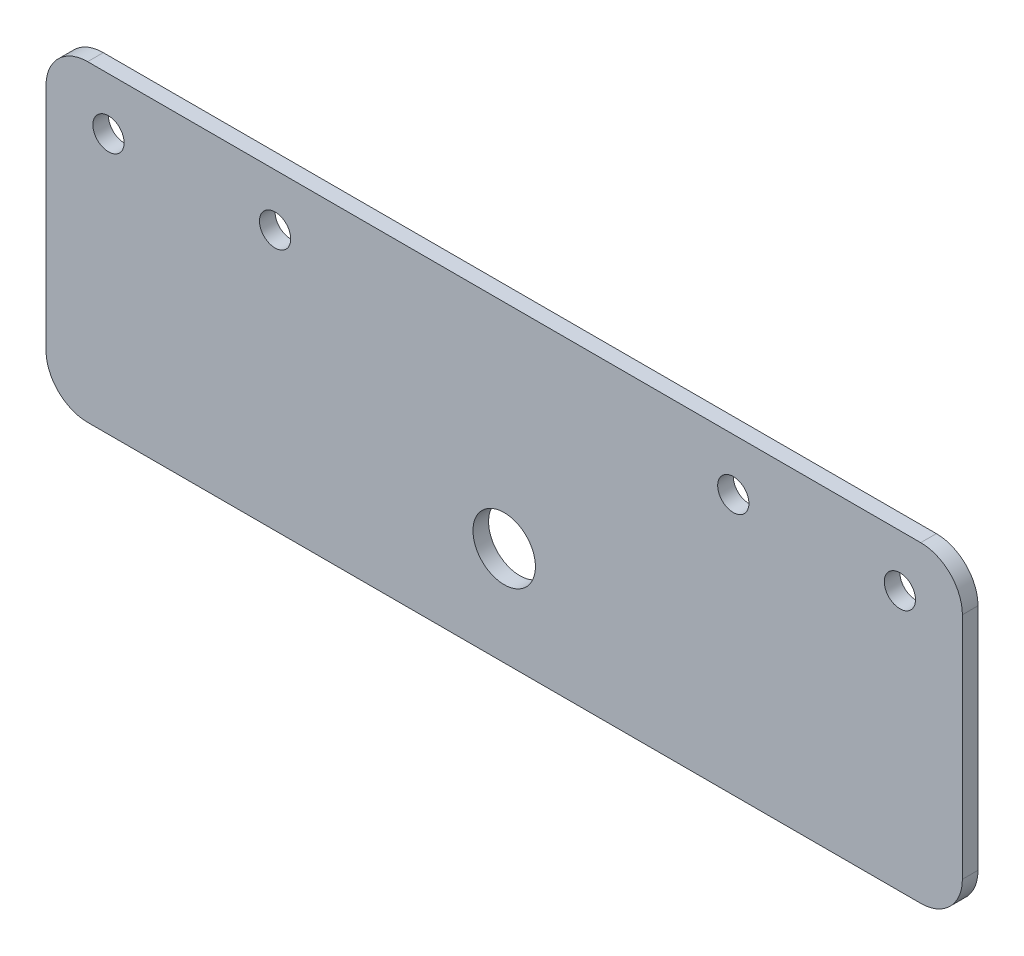
ISO-10303-21;
HEADER;
FILE_DESCRIPTION(('STEP AP214'),'2;1');
FILE_NAME('part.step','',(''),(''),'','','');
FILE_SCHEMA(('AUTOMOTIVE_DESIGN { 1 0 10303 214 1 1 1 1 }'));
ENDSEC;
DATA;
#1=APPLICATION_CONTEXT('core data for automotive mechanical design processes');
#2=APPLICATION_PROTOCOL_DEFINITION('international standard','automotive_design',2000,#1);
#3=PRODUCT_CONTEXT('',#1,'mechanical');
#4=PRODUCT('Part','Part','',(#3));
#5=PRODUCT_RELATED_PRODUCT_CATEGORY('part','',(#4));
#6=PRODUCT_DEFINITION_FORMATION('','',#4);
#7=PRODUCT_DEFINITION_CONTEXT('part definition',#1,'design');
#8=PRODUCT_DEFINITION('design','',#6,#7);
#9=PRODUCT_DEFINITION_SHAPE('','',#8);
#10=(LENGTH_UNIT() NAMED_UNIT(*) SI_UNIT(.MILLI.,.METRE.));
#11=(NAMED_UNIT(*) PLANE_ANGLE_UNIT() SI_UNIT($,.RADIAN.));
#12=(NAMED_UNIT(*) SI_UNIT($,.STERADIAN.) SOLID_ANGLE_UNIT());
#13=UNCERTAINTY_MEASURE_WITH_UNIT(LENGTH_MEASURE(1.E-05),#10,'distance_accuracy_value','');
#14=(GEOMETRIC_REPRESENTATION_CONTEXT(3) GLOBAL_UNCERTAINTY_ASSIGNED_CONTEXT((#13)) GLOBAL_UNIT_ASSIGNED_CONTEXT((#10,
#11,#12)) REPRESENTATION_CONTEXT('',''));
#15=CARTESIAN_POINT('',(0.,0.,0.));
#16=DIRECTION('',(0.,0.,1.));
#17=DIRECTION('',(1.,0.,0.));
#18=AXIS2_PLACEMENT_3D('',#15,#16,#17);
#19=CARTESIAN_POINT('',(-35.8012608557159,7.03084673362314,1.5));
#20=DIRECTION('',(0.,0.,-1.));
#21=DIRECTION('',(-1.,0.,0.));
#22=AXIS2_PLACEMENT_3D('',#19,#20,#21);
#23=PLANE('',#22);
#24=DIRECTION('',(-1.,0.,0.));
#25=VECTOR('',#24,1.);
#26=CARTESIAN_POINT('',(-25.8012608557159,11.0308467336231,1.5));
#27=LINE('',#26,#25);
#28=CARTESIAN_POINT('',(44.1987391442841,11.0308467336231,1.5));
#29=VERTEX_POINT('',#28);
#30=CARTESIAN_POINT('',(-35.8012608557159,11.0308467336231,1.5));
#31=VERTEX_POINT('',#30);
#32=EDGE_CURVE('E57',#29,#31,#27,.T.);
#33=ORIENTED_EDGE('',*,*,#32,.T.);
#34=CARTESIAN_POINT('',(-35.8012608557159,7.03084673362314,1.5));
#35=DIRECTION('',(0.,0.,1.));
#36=DIRECTION('',(-1.,0.,0.));
#37=AXIS2_PLACEMENT_3D('',#34,#35,#36);
#38=CIRCLE('',#37,4.);
#39=CARTESIAN_POINT('',(-39.8012608557159,7.03084673362311,1.5));
#40=VERTEX_POINT('',#39);
#41=EDGE_CURVE('E102',#31,#40,#38,.T.);
#42=ORIENTED_EDGE('',*,*,#41,.T.);
#43=DIRECTION('',(0.,-1.,0.));
#44=VECTOR('',#43,1.);
#45=CARTESIAN_POINT('',(-39.8012608557159,7.03084673362311,1.5));
#46=LINE('',#45,#44);
#47=CARTESIAN_POINT('',(-39.8012608557159,-14.9691532663769,1.5));
#48=VERTEX_POINT('',#47);
#49=EDGE_CURVE('E189',#40,#48,#46,.T.);
#50=ORIENTED_EDGE('',*,*,#49,.T.);
#51=CARTESIAN_POINT('',(-35.8012608557159,-14.9691532663769,1.5));
#52=DIRECTION('',(0.,0.,1.));
#53=DIRECTION('',(-1.,0.,0.));
#54=AXIS2_PLACEMENT_3D('',#51,#52,#53);
#55=CIRCLE('',#54,4.);
#56=CARTESIAN_POINT('',(-35.8012608557159,-18.9691532663769,1.5));
#57=VERTEX_POINT('',#56);
#58=EDGE_CURVE('E200',#48,#57,#55,.T.);
#59=ORIENTED_EDGE('',*,*,#58,.T.);
#60=DIRECTION('',(1.,0.,0.));
#61=VECTOR('',#60,1.);
#62=CARTESIAN_POINT('',(-35.8012608557159,-18.9691532663769,1.5));
#63=LINE('',#62,#61);
#64=CARTESIAN_POINT('',(44.1987391442841,-18.9691532663769,1.5));
#65=VERTEX_POINT('',#64);
#66=EDGE_CURVE('E122',#57,#65,#63,.T.);
#67=ORIENTED_EDGE('',*,*,#66,.T.);
#68=CARTESIAN_POINT('',(44.1987391442841,-14.9691532663769,1.5));
#69=DIRECTION('',(0.,0.,1.));
#70=DIRECTION('',(-1.,0.,0.));
#71=AXIS2_PLACEMENT_3D('',#68,#69,#70);
#72=CIRCLE('',#71,4.);
#73=CARTESIAN_POINT('',(48.1987391442841,-14.9691532663768,1.5));
#74=VERTEX_POINT('',#73);
#75=EDGE_CURVE('E116',#65,#74,#72,.T.);
#76=ORIENTED_EDGE('',*,*,#75,.T.);
#77=DIRECTION('',(0.,1.,0.));
#78=VECTOR('',#77,1.);
#79=CARTESIAN_POINT('',(48.1987391442841,7.03084673362311,1.5));
#80=LINE('',#79,#78);
#81=CARTESIAN_POINT('',(48.1987391442841,7.03084673362311,1.5));
#82=VERTEX_POINT('',#81);
#83=EDGE_CURVE('E120',#74,#82,#80,.T.);
#84=ORIENTED_EDGE('',*,*,#83,.T.);
#85=CARTESIAN_POINT('',(44.1987391442841,7.03084673362314,1.5));
#86=DIRECTION('',(0.,0.,1.));
#87=DIRECTION('',(-1.,0.,0.));
#88=AXIS2_PLACEMENT_3D('',#85,#86,#87);
#89=CIRCLE('',#88,4.);
#90=EDGE_CURVE('E139',#82,#29,#89,.T.);
#91=ORIENTED_EDGE('',*,*,#90,.T.);
#92=EDGE_LOOP('',(#33,#42,#50,#59,#67,#76,#84,#91));
#93=FACE_BOUND('',#92,.T.);
#94=CARTESIAN_POINT('',(4.19873914428409,-9.46915326637686,1.5));
#95=DIRECTION('',(0.,0.,1.));
#96=DIRECTION('',(1.,0.,0.));
#97=AXIS2_PLACEMENT_3D('',#94,#95,#96);
#98=CIRCLE('',#97,3.);
#99=CARTESIAN_POINT('',(7.19873914428409,-9.46915326637686,1.5));
#100=VERTEX_POINT('',#99);
#101=EDGE_CURVE('E150',#100,#100,#98,.T.);
#102=ORIENTED_EDGE('',*,*,#101,.F.);
#103=EDGE_LOOP('',(#102));
#104=FACE_BOUND('',#103,.T.);
#105=CARTESIAN_POINT('',(-17.8012608557159,6.03084673362314,1.5));
#106=DIRECTION('',(0.,0.,1.));
#107=DIRECTION('',(1.,0.,0.));
#108=AXIS2_PLACEMENT_3D('',#105,#106,#107);
#109=CIRCLE('',#108,1.5);
#110=CARTESIAN_POINT('',(-16.3012608557159,6.03084673362314,1.5));
#111=VERTEX_POINT('',#110);
#112=EDGE_CURVE('E214',#111,#111,#109,.T.);
#113=ORIENTED_EDGE('',*,*,#112,.F.);
#114=EDGE_LOOP('',(#113));
#115=FACE_BOUND('',#114,.T.);
#116=CARTESIAN_POINT('',(-33.8012608557159,6.03084673362314,1.5));
#117=DIRECTION('',(0.,0.,1.));
#118=DIRECTION('',(1.,0.,0.));
#119=AXIS2_PLACEMENT_3D('',#116,#117,#118);
#120=CIRCLE('',#119,1.5);
#121=CARTESIAN_POINT('',(-32.3012608557159,6.03084673362314,1.5));
#122=VERTEX_POINT('',#121);
#123=EDGE_CURVE('E222',#122,#122,#120,.T.);
#124=ORIENTED_EDGE('',*,*,#123,.F.);
#125=EDGE_LOOP('',(#124));
#126=FACE_BOUND('',#125,.T.);
#127=CARTESIAN_POINT('',(26.1987391442841,6.03084673362314,1.5));
#128=DIRECTION('',(0.,0.,1.));
#129=DIRECTION('',(1.,0.,0.));
#130=AXIS2_PLACEMENT_3D('',#127,#128,#129);
#131=CIRCLE('',#130,1.5);
#132=CARTESIAN_POINT('',(27.6987391442841,6.03084673362314,1.5));
#133=VERTEX_POINT('',#132);
#134=EDGE_CURVE('E230',#133,#133,#131,.T.);
#135=ORIENTED_EDGE('',*,*,#134,.F.);
#136=EDGE_LOOP('',(#135));
#137=FACE_BOUND('',#136,.T.);
#138=CARTESIAN_POINT('',(42.1987391442841,6.03084673362314,1.5));
#139=DIRECTION('',(0.,0.,1.));
#140=DIRECTION('',(1.,0.,0.));
#141=AXIS2_PLACEMENT_3D('',#138,#139,#140);
#142=CIRCLE('',#141,1.5);
#143=CARTESIAN_POINT('',(43.6987391442841,6.03084673362314,1.5));
#144=VERTEX_POINT('',#143);
#145=EDGE_CURVE('E238',#144,#144,#142,.T.);
#146=ORIENTED_EDGE('',*,*,#145,.F.);
#147=EDGE_LOOP('',(#146));
#148=FACE_BOUND('',#147,.T.);
#149=ADVANCED_FACE('F39',(#93,#104,#115,#126,#137,#148),#23,.F.);
#150=CARTESIAN_POINT('',(-35.8012608557159,7.03084673362314,0.));
#151=DIRECTION('',(0.,0.,-1.));
#152=DIRECTION('',(-1.,0.,0.));
#153=AXIS2_PLACEMENT_3D('',#150,#151,#152);
#154=PLANE('',#153);
#155=CARTESIAN_POINT('',(26.1987391442841,6.03084673362314,0.));
#156=DIRECTION('',(0.,0.,1.));
#157=DIRECTION('',(1.,0.,0.));
#158=AXIS2_PLACEMENT_3D('',#155,#156,#157);
#159=CIRCLE('',#158,1.5);
#160=CARTESIAN_POINT('',(27.6987391442841,6.03084673362314,0.));
#161=VERTEX_POINT('',#160);
#162=EDGE_CURVE('E234',#161,#161,#159,.T.);
#163=ORIENTED_EDGE('',*,*,#162,.T.);
#164=EDGE_LOOP('',(#163));
#165=FACE_BOUND('',#164,.T.);
#166=CARTESIAN_POINT('',(-17.8012608557159,6.03084673362314,0.));
#167=DIRECTION('',(0.,0.,1.));
#168=DIRECTION('',(1.,0.,0.));
#169=AXIS2_PLACEMENT_3D('',#166,#167,#168);
#170=CIRCLE('',#169,1.5);
#171=CARTESIAN_POINT('',(-16.3012608557159,6.03084673362314,0.));
#172=VERTEX_POINT('',#171);
#173=EDGE_CURVE('E218',#172,#172,#170,.T.);
#174=ORIENTED_EDGE('',*,*,#173,.T.);
#175=EDGE_LOOP('',(#174));
#176=FACE_BOUND('',#175,.T.);
#177=CARTESIAN_POINT('',(-35.8012608557159,7.03084673362314,0.));
#178=DIRECTION('',(0.,0.,1.));
#179=DIRECTION('',(-1.,0.,0.));
#180=AXIS2_PLACEMENT_3D('',#177,#178,#179);
#181=CIRCLE('',#180,4.);
#182=CARTESIAN_POINT('',(-35.8012608557159,11.0308467336231,0.));
#183=VERTEX_POINT('',#182);
#184=CARTESIAN_POINT('',(-39.8012608557159,7.03084673362311,0.));
#185=VERTEX_POINT('',#184);
#186=EDGE_CURVE('E146',#183,#185,#181,.T.);
#187=ORIENTED_EDGE('',*,*,#186,.F.);
#188=DIRECTION('',(-1.,0.,0.));
#189=VECTOR('',#188,1.);
#190=CARTESIAN_POINT('',(-25.8012608557159,11.0308467336231,0.));
#191=LINE('',#190,#189);
#192=CARTESIAN_POINT('',(44.1987391442841,11.0308467336231,0.));
#193=VERTEX_POINT('',#192);
#194=EDGE_CURVE('E94',#193,#183,#191,.T.);
#195=ORIENTED_EDGE('',*,*,#194,.F.);
#196=CARTESIAN_POINT('',(44.1987391442841,7.03084673362314,0.));
#197=DIRECTION('',(0.,0.,1.));
#198=DIRECTION('',(-1.,0.,0.));
#199=AXIS2_PLACEMENT_3D('',#196,#197,#198);
#200=CIRCLE('',#199,4.);
#201=CARTESIAN_POINT('',(48.1987391442841,7.03084673362311,0.));
#202=VERTEX_POINT('',#201);
#203=EDGE_CURVE('E164',#202,#193,#200,.T.);
#204=ORIENTED_EDGE('',*,*,#203,.F.);
#205=DIRECTION('',(0.,1.,0.));
#206=VECTOR('',#205,1.);
#207=CARTESIAN_POINT('',(48.1987391442841,7.03084673362311,0.));
#208=LINE('',#207,#206);
#209=CARTESIAN_POINT('',(48.1987391442841,-14.9691532663768,0.));
#210=VERTEX_POINT('',#209);
#211=EDGE_CURVE('E87',#210,#202,#208,.T.);
#212=ORIENTED_EDGE('',*,*,#211,.F.);
#213=CARTESIAN_POINT('',(44.1987391442841,-14.9691532663769,0.));
#214=DIRECTION('',(0.,0.,1.));
#215=DIRECTION('',(-1.,0.,0.));
#216=AXIS2_PLACEMENT_3D('',#213,#214,#215);
#217=CIRCLE('',#216,4.);
#218=CARTESIAN_POINT('',(44.1987391442841,-18.9691532663769,0.));
#219=VERTEX_POINT('',#218);
#220=EDGE_CURVE('E131',#219,#210,#217,.T.);
#221=ORIENTED_EDGE('',*,*,#220,.F.);
#222=DIRECTION('',(1.,0.,0.));
#223=VECTOR('',#222,1.);
#224=CARTESIAN_POINT('',(44.1987391442841,-18.9691532663769,0.));
#225=LINE('',#224,#223);
#226=CARTESIAN_POINT('',(-35.8012608557159,-18.9691532663769,0.));
#227=VERTEX_POINT('',#226);
#228=EDGE_CURVE('E157',#227,#219,#225,.T.);
#229=ORIENTED_EDGE('',*,*,#228,.F.);
#230=CARTESIAN_POINT('',(-35.8012608557159,-14.9691532663769,0.));
#231=DIRECTION('',(0.,0.,1.));
#232=DIRECTION('',(-1.,0.,0.));
#233=AXIS2_PLACEMENT_3D('',#230,#231,#232);
#234=CIRCLE('',#233,4.);
#235=CARTESIAN_POINT('',(-39.8012608557159,-14.9691532663769,0.));
#236=VERTEX_POINT('',#235);
#237=EDGE_CURVE('E153',#236,#227,#234,.T.);
#238=ORIENTED_EDGE('',*,*,#237,.F.);
#239=DIRECTION('',(0.,-1.,0.));
#240=VECTOR('',#239,1.);
#241=CARTESIAN_POINT('',(-39.8012608557159,7.03084673362311,0.));
#242=LINE('',#241,#240);
#243=EDGE_CURVE('E149',#185,#236,#242,.T.);
#244=ORIENTED_EDGE('',*,*,#243,.F.);
#245=EDGE_LOOP('',(#187,#195,#204,#212,#221,#229,#238,#244));
#246=FACE_BOUND('',#245,.T.);
#247=CARTESIAN_POINT('',(4.19873914428409,-9.46915326637686,0.));
#248=DIRECTION('',(0.,0.,1.));
#249=DIRECTION('',(1.,0.,0.));
#250=AXIS2_PLACEMENT_3D('',#247,#248,#249);
#251=CIRCLE('',#250,3.);
#252=CARTESIAN_POINT('',(7.19873914428409,-9.46915326637686,0.));
#253=VERTEX_POINT('',#252);
#254=EDGE_CURVE('E210',#253,#253,#251,.T.);
#255=ORIENTED_EDGE('',*,*,#254,.T.);
#256=EDGE_LOOP('',(#255));
#257=FACE_BOUND('',#256,.T.);
#258=CARTESIAN_POINT('',(-33.8012608557159,6.03084673362314,0.));
#259=DIRECTION('',(0.,0.,1.));
#260=DIRECTION('',(1.,0.,0.));
#261=AXIS2_PLACEMENT_3D('',#258,#259,#260);
#262=CIRCLE('',#261,1.5);
#263=CARTESIAN_POINT('',(-32.3012608557159,6.03084673362314,0.));
#264=VERTEX_POINT('',#263);
#265=EDGE_CURVE('E226',#264,#264,#262,.T.);
#266=ORIENTED_EDGE('',*,*,#265,.T.);
#267=EDGE_LOOP('',(#266));
#268=FACE_BOUND('',#267,.T.);
#269=CARTESIAN_POINT('',(42.1987391442841,6.03084673362314,0.));
#270=DIRECTION('',(0.,0.,1.));
#271=DIRECTION('',(1.,0.,0.));
#272=AXIS2_PLACEMENT_3D('',#269,#270,#271);
#273=CIRCLE('',#272,1.5);
#274=CARTESIAN_POINT('',(43.6987391442841,6.03084673362314,0.));
#275=VERTEX_POINT('',#274);
#276=EDGE_CURVE('E242',#275,#275,#273,.T.);
#277=ORIENTED_EDGE('',*,*,#276,.T.);
#278=EDGE_LOOP('',(#277));
#279=FACE_BOUND('',#278,.T.);
#280=ADVANCED_FACE('F191',(#165,#176,#246,#257,#268,#279),#154,.T.);
#281=CARTESIAN_POINT('',(-35.8012608557159,7.03084673362314,1.5));
#282=DIRECTION('',(0.,0.,-1.));
#283=DIRECTION('',(-1.,0.,0.));
#284=AXIS2_PLACEMENT_3D('',#281,#282,#283);
#285=CYLINDRICAL_SURFACE('',#284,4.);
#286=ORIENTED_EDGE('',*,*,#186,.T.);
#287=DIRECTION('',(0.,0.,-1.));
#288=VECTOR('',#287,1.);
#289=CARTESIAN_POINT('',(-39.8012608557159,7.03084673362311,1.5));
#290=LINE('',#289,#288);
#291=EDGE_CURVE('E49',#40,#185,#290,.T.);
#292=ORIENTED_EDGE('',*,*,#291,.F.);
#293=ORIENTED_EDGE('',*,*,#41,.F.);
#294=DIRECTION('',(0.,0.,-1.));
#295=VECTOR('',#294,1.);
#296=CARTESIAN_POINT('',(-35.8012608557159,11.0308467336231,1.5));
#297=LINE('',#296,#295);
#298=EDGE_CURVE('E11',#31,#183,#297,.T.);
#299=ORIENTED_EDGE('',*,*,#298,.T.);
#300=EDGE_LOOP('',(#286,#292,#293,#299));
#301=FACE_BOUND('',#300,.T.);
#302=ADVANCED_FACE('F41',(#301),#285,.T.);
#303=CARTESIAN_POINT('',(-39.8012608557159,7.03084673362311,1.5));
#304=DIRECTION('',(1.,0.,0.));
#305=DIRECTION('',(0.,0.,-1.));
#306=AXIS2_PLACEMENT_3D('',#303,#304,#305);
#307=PLANE('',#306);
#308=ORIENTED_EDGE('',*,*,#243,.T.);
#309=DIRECTION('',(0.,0.,-1.));
#310=VECTOR('',#309,1.);
#311=CARTESIAN_POINT('',(-39.8012608557159,-14.9691532663769,1.5));
#312=LINE('',#311,#310);
#313=EDGE_CURVE('E179',#48,#236,#312,.T.);
#314=ORIENTED_EDGE('',*,*,#313,.F.);
#315=ORIENTED_EDGE('',*,*,#49,.F.);
#316=ORIENTED_EDGE('',*,*,#291,.T.);
#317=EDGE_LOOP('',(#308,#314,#315,#316));
#318=FACE_BOUND('',#317,.T.);
#319=ADVANCED_FACE('F187',(#318),#307,.F.);
#320=CARTESIAN_POINT('',(-35.8012608557159,-14.9691532663769,1.5));
#321=DIRECTION('',(0.,0.,-1.));
#322=DIRECTION('',(-1.,0.,0.));
#323=AXIS2_PLACEMENT_3D('',#320,#321,#322);
#324=CYLINDRICAL_SURFACE('',#323,4.);
#325=ORIENTED_EDGE('',*,*,#237,.T.);
#326=DIRECTION('',(0.,0.,-1.));
#327=VECTOR('',#326,1.);
#328=CARTESIAN_POINT('',(-35.8012608557159,-18.9691532663769,1.5));
#329=LINE('',#328,#327);
#330=EDGE_CURVE('E175',#57,#227,#329,.T.);
#331=ORIENTED_EDGE('',*,*,#330,.F.);
#332=ORIENTED_EDGE('',*,*,#58,.F.);
#333=ORIENTED_EDGE('',*,*,#313,.T.);
#334=EDGE_LOOP('',(#325,#331,#332,#333));
#335=FACE_BOUND('',#334,.T.);
#336=ADVANCED_FACE('F195',(#335),#324,.T.);
#337=CARTESIAN_POINT('',(44.1987391442841,-18.9691532663769,1.5));
#338=DIRECTION('',(0.,1.,0.));
#339=DIRECTION('',(0.,0.,1.));
#340=AXIS2_PLACEMENT_3D('',#337,#338,#339);
#341=PLANE('',#340);
#342=ORIENTED_EDGE('',*,*,#228,.T.);
#343=DIRECTION('',(0.,0.,-1.));
#344=VECTOR('',#343,1.);
#345=CARTESIAN_POINT('',(44.1987391442841,-18.9691532663769,1.5));
#346=LINE('',#345,#344);
#347=EDGE_CURVE('E133',#65,#219,#346,.T.);
#348=ORIENTED_EDGE('',*,*,#347,.F.);
#349=ORIENTED_EDGE('',*,*,#66,.F.);
#350=ORIENTED_EDGE('',*,*,#330,.T.);
#351=EDGE_LOOP('',(#342,#348,#349,#350));
#352=FACE_BOUND('',#351,.T.);
#353=ADVANCED_FACE('F198',(#352),#341,.F.);
#354=CARTESIAN_POINT('',(44.1987391442841,-14.9691532663769,1.5));
#355=DIRECTION('',(0.,0.,-1.));
#356=DIRECTION('',(-1.,0.,0.));
#357=AXIS2_PLACEMENT_3D('',#354,#355,#356);
#358=CYLINDRICAL_SURFACE('',#357,4.);
#359=ORIENTED_EDGE('',*,*,#220,.T.);
#360=DIRECTION('',(0.,0.,-1.));
#361=VECTOR('',#360,1.);
#362=CARTESIAN_POINT('',(48.1987391442841,-14.9691532663768,1.5));
#363=LINE('',#362,#361);
#364=EDGE_CURVE('E128',#74,#210,#363,.T.);
#365=ORIENTED_EDGE('',*,*,#364,.F.);
#366=ORIENTED_EDGE('',*,*,#75,.F.);
#367=ORIENTED_EDGE('',*,*,#347,.T.);
#368=EDGE_LOOP('',(#359,#365,#366,#367));
#369=FACE_BOUND('',#368,.T.);
#370=ADVANCED_FACE('F129',(#369),#358,.T.);
#371=CARTESIAN_POINT('',(48.1987391442841,7.03084673362311,1.5));
#372=DIRECTION('',(-1.,0.,0.));
#373=DIRECTION('',(0.,0.,1.));
#374=AXIS2_PLACEMENT_3D('',#371,#372,#373);
#375=PLANE('',#374);
#376=ORIENTED_EDGE('',*,*,#211,.T.);
#377=DIRECTION('',(0.,0.,-1.));
#378=VECTOR('',#377,1.);
#379=CARTESIAN_POINT('',(48.1987391442841,7.03084673362311,1.5));
#380=LINE('',#379,#378);
#381=EDGE_CURVE('E134',#82,#202,#380,.T.);
#382=ORIENTED_EDGE('',*,*,#381,.F.);
#383=ORIENTED_EDGE('',*,*,#83,.F.);
#384=ORIENTED_EDGE('',*,*,#364,.T.);
#385=EDGE_LOOP('',(#376,#382,#383,#384));
#386=FACE_BOUND('',#385,.T.);
#387=ADVANCED_FACE('F136',(#386),#375,.F.);
#388=CARTESIAN_POINT('',(44.1987391442841,7.03084673362314,1.5));
#389=DIRECTION('',(0.,0.,-1.));
#390=DIRECTION('',(-1.,0.,0.));
#391=AXIS2_PLACEMENT_3D('',#388,#389,#390);
#392=CYLINDRICAL_SURFACE('',#391,4.);
#393=ORIENTED_EDGE('',*,*,#203,.T.);
#394=DIRECTION('',(0.,0.,-1.));
#395=VECTOR('',#394,1.);
#396=CARTESIAN_POINT('',(44.1987391442841,11.0308467336231,1.5));
#397=LINE('',#396,#395);
#398=EDGE_CURVE('E142',#29,#193,#397,.T.);
#399=ORIENTED_EDGE('',*,*,#398,.F.);
#400=ORIENTED_EDGE('',*,*,#90,.F.);
#401=ORIENTED_EDGE('',*,*,#381,.T.);
#402=EDGE_LOOP('',(#393,#399,#400,#401));
#403=FACE_BOUND('',#402,.T.);
#404=ADVANCED_FACE('F267',(#403),#392,.T.);
#405=CARTESIAN_POINT('',(-25.8012608557159,11.0308467336231,1.5));
#406=DIRECTION('',(0.,-1.,0.));
#407=DIRECTION('',(0.,0.,-1.));
#408=AXIS2_PLACEMENT_3D('',#405,#406,#407);
#409=PLANE('',#408);
#410=ORIENTED_EDGE('',*,*,#194,.T.);
#411=ORIENTED_EDGE('',*,*,#298,.F.);
#412=ORIENTED_EDGE('',*,*,#32,.F.);
#413=ORIENTED_EDGE('',*,*,#398,.T.);
#414=EDGE_LOOP('',(#410,#411,#412,#413));
#415=FACE_BOUND('',#414,.T.);
#416=ADVANCED_FACE('F264',(#415),#409,.F.);
#417=CARTESIAN_POINT('',(4.19873914428409,-9.46915326637686,1.5));
#418=DIRECTION('',(0.,0.,-1.));
#419=DIRECTION('',(-1.,0.,0.));
#420=AXIS2_PLACEMENT_3D('',#417,#418,#419);
#421=CYLINDRICAL_SURFACE('',#420,3.);
#422=ORIENTED_EDGE('',*,*,#101,.T.);
#423=EDGE_LOOP('',(#422));
#424=FACE_BOUND('',#423,.T.);
#425=ORIENTED_EDGE('',*,*,#254,.F.);
#426=EDGE_LOOP('',(#425));
#427=FACE_BOUND('',#426,.T.);
#428=ADVANCED_FACE('F261',(#424,#427),#421,.F.);
#429=CARTESIAN_POINT('',(-17.8012608557159,6.03084673362314,1.5));
#430=DIRECTION('',(0.,0.,-1.));
#431=DIRECTION('',(-1.,0.,0.));
#432=AXIS2_PLACEMENT_3D('',#429,#430,#431);
#433=CYLINDRICAL_SURFACE('',#432,1.5);
#434=ORIENTED_EDGE('',*,*,#112,.T.);
#435=EDGE_LOOP('',(#434));
#436=FACE_BOUND('',#435,.T.);
#437=ORIENTED_EDGE('',*,*,#173,.F.);
#438=EDGE_LOOP('',(#437));
#439=FACE_BOUND('',#438,.T.);
#440=ADVANCED_FACE('F351',(#436,#439),#433,.F.);
#441=CARTESIAN_POINT('',(-33.8012608557159,6.03084673362314,1.5));
#442=DIRECTION('',(0.,0.,-1.));
#443=DIRECTION('',(-1.,0.,0.));
#444=AXIS2_PLACEMENT_3D('',#441,#442,#443);
#445=CYLINDRICAL_SURFACE('',#444,1.5);
#446=ORIENTED_EDGE('',*,*,#123,.T.);
#447=EDGE_LOOP('',(#446));
#448=FACE_BOUND('',#447,.T.);
#449=ORIENTED_EDGE('',*,*,#265,.F.);
#450=EDGE_LOOP('',(#449));
#451=FACE_BOUND('',#450,.T.);
#452=ADVANCED_FACE('F359',(#448,#451),#445,.F.);
#453=CARTESIAN_POINT('',(26.1987391442841,6.03084673362314,1.5));
#454=DIRECTION('',(0.,0.,-1.));
#455=DIRECTION('',(-1.,0.,0.));
#456=AXIS2_PLACEMENT_3D('',#453,#454,#455);
#457=CYLINDRICAL_SURFACE('',#456,1.5);
#458=ORIENTED_EDGE('',*,*,#134,.T.);
#459=EDGE_LOOP('',(#458));
#460=FACE_BOUND('',#459,.T.);
#461=ORIENTED_EDGE('',*,*,#162,.F.);
#462=EDGE_LOOP('',(#461));
#463=FACE_BOUND('',#462,.T.);
#464=ADVANCED_FACE('F367',(#460,#463),#457,.F.);
#465=CARTESIAN_POINT('',(42.1987391442841,6.03084673362314,1.5));
#466=DIRECTION('',(0.,0.,-1.));
#467=DIRECTION('',(-1.,0.,0.));
#468=AXIS2_PLACEMENT_3D('',#465,#466,#467);
#469=CYLINDRICAL_SURFACE('',#468,1.5);
#470=ORIENTED_EDGE('',*,*,#145,.T.);
#471=EDGE_LOOP('',(#470));
#472=FACE_BOUND('',#471,.T.);
#473=ORIENTED_EDGE('',*,*,#276,.F.);
#474=EDGE_LOOP('',(#473));
#475=FACE_BOUND('',#474,.T.);
#476=ADVANCED_FACE('F250',(#472,#475),#469,.F.);
#477=CLOSED_SHELL('',(#149,#280,#302,#319,#336,#353,#370,#387,#404,#416,#428,#440,#452,#464,#476));
#478=MANIFOLD_SOLID_BREP('B2',#477);
#479=ADVANCED_BREP_SHAPE_REPRESENTATION('',(#18,#478),#14);
#480=SHAPE_DEFINITION_REPRESENTATION(#9,#479);
ENDSEC;
END-ISO-10303-21;
